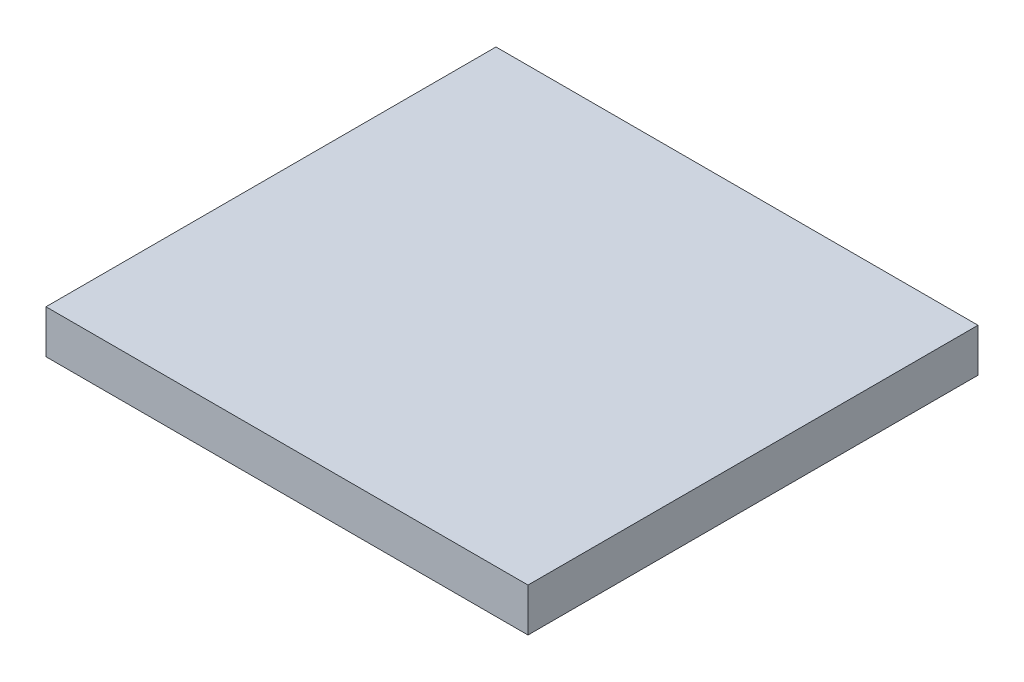
ISO-10303-21;
HEADER;
FILE_DESCRIPTION(('STEP AP214'),'2;1');
FILE_NAME('part.step','',(''),(''),'','','');
FILE_SCHEMA(('AUTOMOTIVE_DESIGN { 1 0 10303 214 1 1 1 1 }'));
ENDSEC;
DATA;
#1=APPLICATION_CONTEXT('core data for automotive mechanical design processes');
#2=APPLICATION_PROTOCOL_DEFINITION('international standard','automotive_design',2000,#1);
#3=PRODUCT_CONTEXT('',#1,'mechanical');
#4=PRODUCT('Part','Part','',(#3));
#5=PRODUCT_RELATED_PRODUCT_CATEGORY('part','',(#4));
#6=PRODUCT_DEFINITION_FORMATION('','',#4);
#7=PRODUCT_DEFINITION_CONTEXT('part definition',#1,'design');
#8=PRODUCT_DEFINITION('design','',#6,#7);
#9=PRODUCT_DEFINITION_SHAPE('','',#8);
#10=(LENGTH_UNIT() NAMED_UNIT(*) SI_UNIT(.MILLI.,.METRE.));
#11=(NAMED_UNIT(*) PLANE_ANGLE_UNIT() SI_UNIT($,.RADIAN.));
#12=(NAMED_UNIT(*) SI_UNIT($,.STERADIAN.) SOLID_ANGLE_UNIT());
#13=UNCERTAINTY_MEASURE_WITH_UNIT(LENGTH_MEASURE(1.E-05),#10,'distance_accuracy_value','');
#14=(GEOMETRIC_REPRESENTATION_CONTEXT(3) GLOBAL_UNCERTAINTY_ASSIGNED_CONTEXT((#13)) GLOBAL_UNIT_ASSIGNED_CONTEXT((#10,
#11,#12)) REPRESENTATION_CONTEXT('',''));
#15=CARTESIAN_POINT('',(0.,0.,0.));
#16=DIRECTION('',(0.,0.,1.));
#17=DIRECTION('',(1.,0.,0.));
#18=AXIS2_PLACEMENT_3D('',#15,#16,#17);
#19=CARTESIAN_POINT('',(-53.8137346149202,18.25625,123.875856199224));
#20=DIRECTION('',(0.,0.,-1.));
#21=DIRECTION('',(-1.,0.,0.));
#22=AXIS2_PLACEMENT_3D('',#19,#20,#21);
#23=PLANE('',#22);
#24=DIRECTION('',(1.,0.,0.));
#25=VECTOR('',#24,1.);
#26=CARTESIAN_POINT('',(-53.8137346149202,0.,123.875856199224));
#27=LINE('',#26,#25);
#28=CARTESIAN_POINT('',(-53.8137346149202,0.,123.875856199224));
#29=VERTEX_POINT('',#28);
#30=CARTESIAN_POINT('',(149.38626538508,0.,123.875856199224));
#31=VERTEX_POINT('',#30);
#32=EDGE_CURVE('E106',#29,#31,#27,.T.);
#33=ORIENTED_EDGE('',*,*,#32,.T.);
#34=DIRECTION('',(0.,-1.,0.));
#35=VECTOR('',#34,1.);
#36=CARTESIAN_POINT('',(149.38626538508,18.25625,123.875856199224));
#37=LINE('',#36,#35);
#38=CARTESIAN_POINT('',(149.38626538508,18.25625,123.875856199224));
#39=VERTEX_POINT('',#38);
#40=EDGE_CURVE('E11',#39,#31,#37,.T.);
#41=ORIENTED_EDGE('',*,*,#40,.F.);
#42=DIRECTION('',(1.,0.,0.));
#43=VECTOR('',#42,1.);
#44=CARTESIAN_POINT('',(-53.8137346149202,18.25625,123.875856199224));
#45=LINE('',#44,#43);
#46=CARTESIAN_POINT('',(-53.8137346149202,18.25625,123.875856199224));
#47=VERTEX_POINT('',#46);
#48=EDGE_CURVE('E79',#47,#39,#45,.T.);
#49=ORIENTED_EDGE('',*,*,#48,.F.);
#50=DIRECTION('',(0.,-1.,0.));
#51=VECTOR('',#50,1.);
#52=CARTESIAN_POINT('',(-53.8137346149202,18.25625,123.875856199224));
#53=LINE('',#52,#51);
#54=EDGE_CURVE('E102',#47,#29,#53,.T.);
#55=ORIENTED_EDGE('',*,*,#54,.T.);
#56=EDGE_LOOP('',(#33,#41,#49,#55));
#57=FACE_BOUND('',#56,.T.);
#58=ADVANCED_FACE('F39',(#57),#23,.F.);
#59=CARTESIAN_POINT('',(149.38626538508,18.25625,-65.8303938007761));
#60=DIRECTION('',(1.,0.,0.));
#61=DIRECTION('',(0.,0.,-1.));
#62=AXIS2_PLACEMENT_3D('',#59,#60,#61);
#63=PLANE('',#62);
#64=DIRECTION('',(0.,0.,1.));
#65=VECTOR('',#64,1.);
#66=CARTESIAN_POINT('',(149.38626538508,0.,-65.8303938007761));
#67=LINE('',#66,#65);
#68=CARTESIAN_POINT('',(149.38626538508,0.,-65.8303938007761));
#69=VERTEX_POINT('',#68);
#70=EDGE_CURVE('E88',#69,#31,#67,.T.);
#71=ORIENTED_EDGE('',*,*,#70,.F.);
#72=DIRECTION('',(0.,-1.,0.));
#73=VECTOR('',#72,1.);
#74=CARTESIAN_POINT('',(149.38626538508,18.25625,-65.8303938007761));
#75=LINE('',#74,#73);
#76=CARTESIAN_POINT('',(149.38626538508,18.25625,-65.8303938007761));
#77=VERTEX_POINT('',#76);
#78=EDGE_CURVE('E48',#77,#69,#75,.T.);
#79=ORIENTED_EDGE('',*,*,#78,.F.);
#80=DIRECTION('',(0.,0.,1.));
#81=VECTOR('',#80,1.);
#82=CARTESIAN_POINT('',(149.38626538508,18.25625,-65.8303938007761));
#83=LINE('',#82,#81);
#84=EDGE_CURVE('E86',#77,#39,#83,.T.);
#85=ORIENTED_EDGE('',*,*,#84,.T.);
#86=ORIENTED_EDGE('',*,*,#40,.T.);
#87=EDGE_LOOP('',(#71,#79,#85,#86));
#88=FACE_BOUND('',#87,.T.);
#89=ADVANCED_FACE('F85',(#88),#63,.T.);
#90=CARTESIAN_POINT('',(-53.8137346149203,18.25625,-65.8303938007761));
#91=DIRECTION('',(0.,0.,-1.));
#92=DIRECTION('',(-1.,0.,0.));
#93=AXIS2_PLACEMENT_3D('',#90,#91,#92);
#94=PLANE('',#93);
#95=DIRECTION('',(1.,0.,0.));
#96=VECTOR('',#95,1.);
#97=CARTESIAN_POINT('',(-53.8137346149203,0.,-65.8303938007761));
#98=LINE('',#97,#96);
#99=CARTESIAN_POINT('',(-53.8137346149203,0.,-65.8303938007761));
#100=VERTEX_POINT('',#99);
#101=EDGE_CURVE('E112',#100,#69,#98,.T.);
#102=ORIENTED_EDGE('',*,*,#101,.F.);
#103=DIRECTION('',(0.,-1.,0.));
#104=VECTOR('',#103,1.);
#105=CARTESIAN_POINT('',(-53.8137346149203,18.25625,-65.8303938007761));
#106=LINE('',#105,#104);
#107=CARTESIAN_POINT('',(-53.8137346149203,18.25625,-65.8303938007761));
#108=VERTEX_POINT('',#107);
#109=EDGE_CURVE('E71',#108,#100,#106,.T.);
#110=ORIENTED_EDGE('',*,*,#109,.F.);
#111=DIRECTION('',(1.,0.,0.));
#112=VECTOR('',#111,1.);
#113=CARTESIAN_POINT('',(-53.8137346149203,18.25625,-65.8303938007761));
#114=LINE('',#113,#112);
#115=EDGE_CURVE('E95',#108,#77,#114,.T.);
#116=ORIENTED_EDGE('',*,*,#115,.T.);
#117=ORIENTED_EDGE('',*,*,#78,.T.);
#118=EDGE_LOOP('',(#102,#110,#116,#117));
#119=FACE_BOUND('',#118,.T.);
#120=ADVANCED_FACE('F98',(#119),#94,.T.);
#121=CARTESIAN_POINT('',(-53.8137346149203,18.25625,-65.8303938007761));
#122=DIRECTION('',(1.,0.,0.));
#123=DIRECTION('',(0.,0.,-1.));
#124=AXIS2_PLACEMENT_3D('',#121,#122,#123);
#125=PLANE('',#124);
#126=DIRECTION('',(0.,0.,1.));
#127=VECTOR('',#126,1.);
#128=CARTESIAN_POINT('',(-53.8137346149203,0.,-65.8303938007761));
#129=LINE('',#128,#127);
#130=EDGE_CURVE('E74',#100,#29,#129,.T.);
#131=ORIENTED_EDGE('',*,*,#130,.T.);
#132=ORIENTED_EDGE('',*,*,#54,.F.);
#133=DIRECTION('',(0.,0.,1.));
#134=VECTOR('',#133,1.);
#135=CARTESIAN_POINT('',(-53.8137346149203,18.25625,-65.8303938007761));
#136=LINE('',#135,#134);
#137=EDGE_CURVE('E56',#108,#47,#136,.T.);
#138=ORIENTED_EDGE('',*,*,#137,.F.);
#139=ORIENTED_EDGE('',*,*,#109,.T.);
#140=EDGE_LOOP('',(#131,#132,#138,#139));
#141=FACE_BOUND('',#140,.T.);
#142=ADVANCED_FACE('F129',(#141),#125,.F.);
#143=CARTESIAN_POINT('',(0.,18.25625,0.));
#144=DIRECTION('',(0.,-1.,0.));
#145=DIRECTION('',(0.,0.,-1.));
#146=AXIS2_PLACEMENT_3D('',#143,#144,#145);
#147=PLANE('',#146);
#148=ORIENTED_EDGE('',*,*,#48,.T.);
#149=ORIENTED_EDGE('',*,*,#84,.F.);
#150=ORIENTED_EDGE('',*,*,#115,.F.);
#151=ORIENTED_EDGE('',*,*,#137,.T.);
#152=EDGE_LOOP('',(#148,#149,#150,#151));
#153=FACE_BOUND('',#152,.T.);
#154=ADVANCED_FACE('F94',(#153),#147,.F.);
#155=CARTESIAN_POINT('',(0.,0.,0.));
#156=DIRECTION('',(0.,-1.,0.));
#157=DIRECTION('',(0.,0.,-1.));
#158=AXIS2_PLACEMENT_3D('',#155,#156,#157);
#159=PLANE('',#158);
#160=ORIENTED_EDGE('',*,*,#32,.F.);
#161=ORIENTED_EDGE('',*,*,#130,.F.);
#162=ORIENTED_EDGE('',*,*,#101,.T.);
#163=ORIENTED_EDGE('',*,*,#70,.T.);
#164=EDGE_LOOP('',(#160,#161,#162,#163));
#165=FACE_BOUND('',#164,.T.);
#166=ADVANCED_FACE('F123',(#165),#159,.T.);
#167=CLOSED_SHELL('',(#58,#89,#120,#142,#154,#166));
#168=MANIFOLD_SOLID_BREP('B2',#167);
#169=ADVANCED_BREP_SHAPE_REPRESENTATION('',(#18,#168),#14);
#170=SHAPE_DEFINITION_REPRESENTATION(#9,#169);
ENDSEC;
END-ISO-10303-21;
